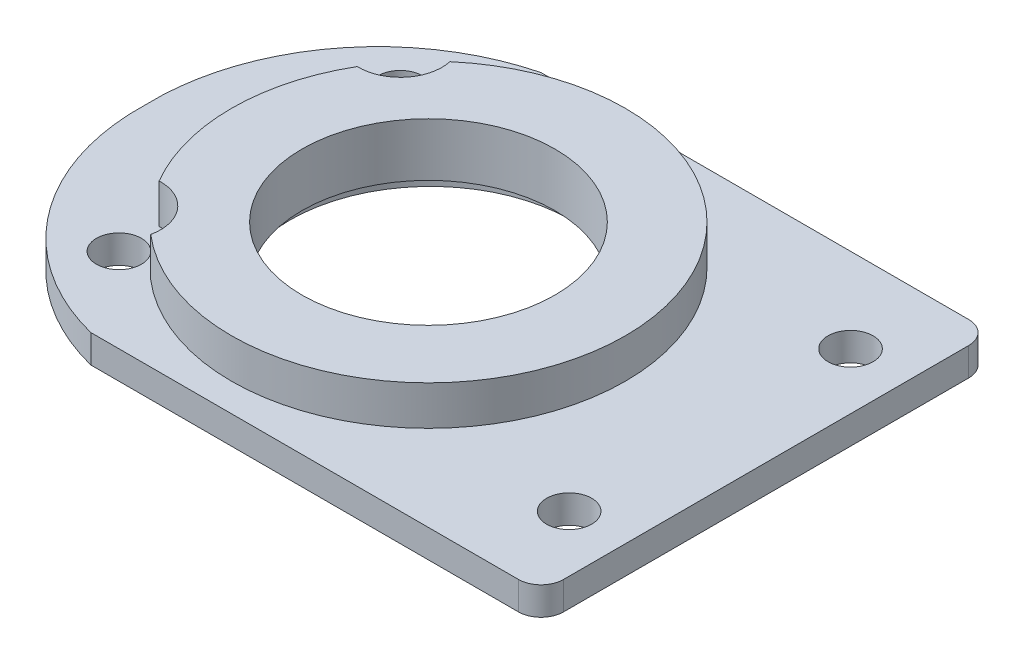
ISO-10303-21;
HEADER;
FILE_DESCRIPTION(('STEP AP214'),'2;1');
FILE_NAME('part.step','',(''),(''),'','','');
FILE_SCHEMA(('AUTOMOTIVE_DESIGN { 1 0 10303 214 1 1 1 1 }'));
ENDSEC;
DATA;
#1=APPLICATION_CONTEXT('core data for automotive mechanical design processes');
#2=APPLICATION_PROTOCOL_DEFINITION('international standard','automotive_design',2000,#1);
#3=PRODUCT_CONTEXT('',#1,'mechanical');
#4=PRODUCT('Part','Part','',(#3));
#5=PRODUCT_RELATED_PRODUCT_CATEGORY('part','',(#4));
#6=PRODUCT_DEFINITION_FORMATION('','',#4);
#7=PRODUCT_DEFINITION_CONTEXT('part definition',#1,'design');
#8=PRODUCT_DEFINITION('design','',#6,#7);
#9=PRODUCT_DEFINITION_SHAPE('','',#8);
#10=(LENGTH_UNIT() NAMED_UNIT(*) SI_UNIT(.MILLI.,.METRE.));
#11=(NAMED_UNIT(*) PLANE_ANGLE_UNIT() SI_UNIT($,.RADIAN.));
#12=(NAMED_UNIT(*) SI_UNIT($,.STERADIAN.) SOLID_ANGLE_UNIT());
#13=UNCERTAINTY_MEASURE_WITH_UNIT(LENGTH_MEASURE(1.E-05),#10,'distance_accuracy_value','');
#14=(GEOMETRIC_REPRESENTATION_CONTEXT(3) GLOBAL_UNCERTAINTY_ASSIGNED_CONTEXT((#13)) GLOBAL_UNIT_ASSIGNED_CONTEXT((#10,
#11,#12)) REPRESENTATION_CONTEXT('',''));
#15=CARTESIAN_POINT('',(0.,0.,0.));
#16=DIRECTION('',(0.,0.,1.));
#17=DIRECTION('',(1.,0.,0.));
#18=AXIS2_PLACEMENT_3D('',#15,#16,#17);
#19=CARTESIAN_POINT('',(38.1,7.62,-25.4));
#20=DIRECTION('',(0.,-1.,0.));
#21=DIRECTION('',(0.,0.,-1.));
#22=AXIS2_PLACEMENT_3D('',#19,#20,#21);
#23=CYLINDRICAL_SURFACE('',#22,22.225);
#24=DIRECTION('',(0.,-1.,0.));
#25=VECTOR('',#24,1.);
#26=CARTESIAN_POINT('',(23.6406384808785,5.3975,-42.2783141770542));
#27=LINE('',#26,#25);
#28=CARTESIAN_POINT('',(23.6406384808785,7.62,-42.2783141770542));
#29=VERTEX_POINT('',#28);
#30=CARTESIAN_POINT('',(23.6406384808785,3.175,-42.2783141770542));
#31=VERTEX_POINT('',#30);
#32=EDGE_CURVE('E121',#29,#31,#27,.T.);
#33=ORIENTED_EDGE('',*,*,#32,.F.);
#34=CARTESIAN_POINT('',(38.1,7.62,-25.4));
#35=DIRECTION('',(0.,1.,0.));
#36=DIRECTION('',(0.,0.,1.));
#37=AXIS2_PLACEMENT_3D('',#34,#35,#36);
#38=CIRCLE('',#37,22.225);
#39=CARTESIAN_POINT('',(23.6406384808785,7.62,-8.52168582294582));
#40=VERTEX_POINT('',#39);
#41=EDGE_CURVE('E216',#40,#29,#38,.T.);
#42=ORIENTED_EDGE('',*,*,#41,.F.);
#43=DIRECTION('',(0.,-1.,0.));
#44=VECTOR('',#43,1.);
#45=CARTESIAN_POINT('',(23.6406384808785,5.3975,-8.52168582294583));
#46=LINE('',#45,#44);
#47=CARTESIAN_POINT('',(23.6406384808785,3.175,-8.52168582294583));
#48=VERTEX_POINT('',#47);
#49=EDGE_CURVE('E62',#48,#40,#46,.F.);
#50=ORIENTED_EDGE('',*,*,#49,.F.);
#51=CARTESIAN_POINT('',(38.1,3.175,-25.4));
#52=DIRECTION('',(0.,-1.,0.));
#53=DIRECTION('',(0.,0.,-1.));
#54=AXIS2_PLACEMENT_3D('',#51,#52,#53);
#55=CIRCLE('',#54,22.225);
#56=EDGE_CURVE('E138',#48,#31,#55,.F.);
#57=ORIENTED_EDGE('',*,*,#56,.T.);
#58=EDGE_LOOP('',(#33,#42,#50,#57));
#59=FACE_BOUND('',#58,.T.);
#60=ADVANCED_FACE('F39',(#59),#23,.T.);
#61=DIRECTION('',(0.,-1.,0.));
#62=VECTOR('',#61,1.);
#63=CARTESIAN_POINT('',(18.8909536502691,5.3975,-36.5786923803229));
#64=LINE('',#63,#62);
#65=CARTESIAN_POINT('',(18.8909536502691,3.175,-36.5786923803229));
#66=VERTEX_POINT('',#65);
#67=CARTESIAN_POINT('',(18.8909536502691,7.62,-36.5786923803229));
#68=VERTEX_POINT('',#67);
#69=EDGE_CURVE('E55',#66,#68,#64,.F.);
#70=ORIENTED_EDGE('',*,*,#69,.F.);
#71=CARTESIAN_POINT('',(18.8909536502691,3.175,-14.2213076196771));
#72=VERTEX_POINT('',#71);
#73=EDGE_CURVE('E139',#66,#72,#55,.F.);
#74=ORIENTED_EDGE('',*,*,#73,.T.);
#75=DIRECTION('',(0.,-1.,0.));
#76=VECTOR('',#75,1.);
#77=CARTESIAN_POINT('',(18.8909536502691,5.3975,-14.2213076196771));
#78=LINE('',#77,#76);
#79=CARTESIAN_POINT('',(18.8909536502691,7.62,-14.2213076196771));
#80=VERTEX_POINT('',#79);
#81=EDGE_CURVE('E245',#80,#72,#78,.T.);
#82=ORIENTED_EDGE('',*,*,#81,.F.);
#83=EDGE_CURVE('E299',#68,#80,#38,.T.);
#84=ORIENTED_EDGE('',*,*,#83,.F.);
#85=EDGE_LOOP('',(#70,#74,#82,#84));
#86=FACE_BOUND('',#85,.T.);
#87=ADVANCED_FACE('F312',(#86),#23,.T.);
#88=CARTESIAN_POINT('',(0.,3.175,0.));
#89=DIRECTION('',(0.,-1.,0.));
#90=DIRECTION('',(0.,0.,-1.));
#91=AXIS2_PLACEMENT_3D('',#88,#89,#90);
#92=PLANE('',#91);
#93=ORIENTED_EDGE('',*,*,#73,.F.);
#94=CARTESIAN_POINT('',(19.05,3.175,-41.275));
#95=DIRECTION('',(0.,1.,0.));
#96=DIRECTION('',(0.,0.,1.));
#97=AXIS2_PLACEMENT_3D('',#94,#95,#96);
#98=CIRCLE('',#97,4.699);
#99=EDGE_CURVE('E124',#66,#31,#98,.T.);
#100=ORIENTED_EDGE('',*,*,#99,.T.);
#101=ORIENTED_EDGE('',*,*,#56,.F.);
#102=CARTESIAN_POINT('',(19.05,3.175,-9.525));
#103=DIRECTION('',(0.,1.,0.));
#104=DIRECTION('',(0.,0.,1.));
#105=AXIS2_PLACEMENT_3D('',#102,#103,#104);
#106=CIRCLE('',#105,4.699);
#107=EDGE_CURVE('E130',#48,#72,#106,.T.);
#108=ORIENTED_EDGE('',*,*,#107,.T.);
#109=EDGE_LOOP('',(#93,#100,#101,#108));
#110=FACE_BOUND('',#109,.T.);
#111=CARTESIAN_POINT('',(69.85,3.175,-41.275));
#112=DIRECTION('',(0.,-1.,0.));
#113=DIRECTION('',(0.,0.,-1.));
#114=AXIS2_PLACEMENT_3D('',#111,#112,#113);
#115=CIRCLE('',#114,2.54);
#116=CARTESIAN_POINT('',(69.85,3.175,-43.815));
#117=VERTEX_POINT('',#116);
#118=EDGE_CURVE('E274',#117,#117,#115,.T.);
#119=ORIENTED_EDGE('',*,*,#118,.T.);
#120=EDGE_LOOP('',(#119));
#121=FACE_BOUND('',#120,.T.);
#122=CARTESIAN_POINT('',(69.85,3.175,-9.525));
#123=DIRECTION('',(0.,-1.,0.));
#124=DIRECTION('',(0.,0.,-1.));
#125=AXIS2_PLACEMENT_3D('',#122,#123,#124);
#126=CIRCLE('',#125,2.54);
#127=CARTESIAN_POINT('',(69.85,3.175,-12.065));
#128=VERTEX_POINT('',#127);
#129=EDGE_CURVE('E278',#128,#128,#126,.T.);
#130=ORIENTED_EDGE('',*,*,#129,.T.);
#131=EDGE_LOOP('',(#130));
#132=FACE_BOUND('',#131,.T.);
#133=CARTESIAN_POINT('',(31.6209430961879,3.175,-26.1735943533416));
#134=DIRECTION('',(0.,1.,0.));
#135=DIRECTION('',(0.,0.,1.));
#136=AXIS2_PLACEMENT_3D('',#133,#134,#135);
#137=CIRCLE('',#136,25.4);
#138=CARTESIAN_POINT('',(25.3999999947823,3.175,-50.8));
#139=VERTEX_POINT('',#138);
#140=CARTESIAN_POINT('',(6.23398657381813,3.175,-25.3596910843292));
#141=VERTEX_POINT('',#140);
#142=EDGE_CURVE('E242',#139,#141,#137,.T.);
#143=ORIENTED_EDGE('',*,*,#142,.T.);
#144=CARTESIAN_POINT('',(31.6233817769977,3.175,-24.6257897171398));
#145=DIRECTION('',(0.,1.,0.));
#146=DIRECTION('',(0.,0.,1.));
#147=AXIS2_PLACEMENT_3D('',#144,#145,#146);
#148=CIRCLE('',#147,25.4);
#149=CARTESIAN_POINT('',(25.3999999947823,3.175,0.));
#150=VERTEX_POINT('',#149);
#151=EDGE_CURVE('E236',#150,#141,#148,.F.);
#152=ORIENTED_EDGE('',*,*,#151,.F.);
#153=DIRECTION('',(1.,0.,0.));
#154=VECTOR('',#153,1.);
#155=CARTESIAN_POINT('',(0.,3.175,0.));
#156=LINE('',#155,#154);
#157=CARTESIAN_POINT('',(73.66,3.175,0.));
#158=VERTEX_POINT('',#157);
#159=EDGE_CURVE('E187',#150,#158,#156,.T.);
#160=ORIENTED_EDGE('',*,*,#159,.T.);
#161=CARTESIAN_POINT('',(73.66,3.175,-2.54));
#162=DIRECTION('',(0.,-1.,0.));
#163=DIRECTION('',(0.,0.,-1.));
#164=AXIS2_PLACEMENT_3D('',#161,#162,#163);
#165=CIRCLE('',#164,2.54);
#166=CARTESIAN_POINT('',(76.2,3.175,-2.54));
#167=VERTEX_POINT('',#166);
#168=EDGE_CURVE('E167',#158,#167,#165,.F.);
#169=ORIENTED_EDGE('',*,*,#168,.T.);
#170=DIRECTION('',(0.,0.,-1.));
#171=VECTOR('',#170,1.);
#172=CARTESIAN_POINT('',(76.2,3.175,0.));
#173=LINE('',#172,#171);
#174=CARTESIAN_POINT('',(76.2,3.175,-48.26));
#175=VERTEX_POINT('',#174);
#176=EDGE_CURVE('E197',#167,#175,#173,.T.);
#177=ORIENTED_EDGE('',*,*,#176,.T.);
#178=CARTESIAN_POINT('',(73.66,3.175,-48.26));
#179=DIRECTION('',(0.,-1.,0.));
#180=DIRECTION('',(0.,0.,-1.));
#181=AXIS2_PLACEMENT_3D('',#178,#179,#180);
#182=CIRCLE('',#181,2.54);
#183=CARTESIAN_POINT('',(73.66,3.175,-50.8));
#184=VERTEX_POINT('',#183);
#185=EDGE_CURVE('E170',#175,#184,#182,.F.);
#186=ORIENTED_EDGE('',*,*,#185,.T.);
#187=DIRECTION('',(-1.,0.,0.));
#188=VECTOR('',#187,1.);
#189=CARTESIAN_POINT('',(0.,3.175,-50.8));
#190=LINE('',#189,#188);
#191=EDGE_CURVE('E150',#184,#139,#190,.T.);
#192=ORIENTED_EDGE('',*,*,#191,.T.);
#193=EDGE_LOOP('',(#143,#152,#160,#169,#177,#186,#192));
#194=FACE_BOUND('',#193,.T.);
#195=CARTESIAN_POINT('',(19.05,3.175,-9.525));
#196=DIRECTION('',(0.,-1.,0.));
#197=DIRECTION('',(0.,0.,-1.));
#198=AXIS2_PLACEMENT_3D('',#195,#196,#197);
#199=CIRCLE('',#198,2.54);
#200=CARTESIAN_POINT('',(19.05,3.175,-12.065));
#201=VERTEX_POINT('',#200);
#202=EDGE_CURVE('E282',#201,#201,#199,.T.);
#203=ORIENTED_EDGE('',*,*,#202,.T.);
#204=EDGE_LOOP('',(#203));
#205=FACE_BOUND('',#204,.T.);
#206=CARTESIAN_POINT('',(19.05,3.175,-41.275));
#207=DIRECTION('',(0.,-1.,0.));
#208=DIRECTION('',(0.,0.,-1.));
#209=AXIS2_PLACEMENT_3D('',#206,#207,#208);
#210=CIRCLE('',#209,2.54);
#211=CARTESIAN_POINT('',(19.05,3.175,-43.815));
#212=VERTEX_POINT('',#211);
#213=EDGE_CURVE('E286',#212,#212,#210,.T.);
#214=ORIENTED_EDGE('',*,*,#213,.T.);
#215=EDGE_LOOP('',(#214));
#216=FACE_BOUND('',#215,.T.);
#217=ADVANCED_FACE('F135',(#110,#121,#132,#194,#205,#216),#92,.F.);
#218=CARTESIAN_POINT('',(0.,0.,0.));
#219=DIRECTION('',(0.,-1.,0.));
#220=DIRECTION('',(0.,0.,-1.));
#221=AXIS2_PLACEMENT_3D('',#218,#219,#220);
#222=PLANE('',#221);
#223=CARTESIAN_POINT('',(19.05,0.,-41.275));
#224=DIRECTION('',(0.,1.,0.));
#225=DIRECTION('',(0.,0.,1.));
#226=AXIS2_PLACEMENT_3D('',#223,#224,#225);
#227=CIRCLE('',#226,2.54);
#228=CARTESIAN_POINT('',(19.05,0.,-38.735));
#229=VERTEX_POINT('',#228);
#230=EDGE_CURVE('E253',#229,#229,#227,.T.);
#231=ORIENTED_EDGE('',*,*,#230,.T.);
#232=EDGE_LOOP('',(#231));
#233=FACE_BOUND('',#232,.T.);
#234=CARTESIAN_POINT('',(19.05,0.,-9.525));
#235=DIRECTION('',(0.,1.,0.));
#236=DIRECTION('',(0.,0.,1.));
#237=AXIS2_PLACEMENT_3D('',#234,#235,#236);
#238=CIRCLE('',#237,2.54);
#239=CARTESIAN_POINT('',(19.05,0.,-6.985));
#240=VERTEX_POINT('',#239);
#241=EDGE_CURVE('E264',#240,#240,#238,.T.);
#242=ORIENTED_EDGE('',*,*,#241,.T.);
#243=EDGE_LOOP('',(#242));
#244=FACE_BOUND('',#243,.T.);
#245=CARTESIAN_POINT('',(69.85,0.,-9.525));
#246=DIRECTION('',(0.,1.,0.));
#247=DIRECTION('',(0.,0.,1.));
#248=AXIS2_PLACEMENT_3D('',#245,#246,#247);
#249=CIRCLE('',#248,2.54);
#250=CARTESIAN_POINT('',(69.85,0.,-6.985));
#251=VERTEX_POINT('',#250);
#252=EDGE_CURVE('E259',#251,#251,#249,.T.);
#253=ORIENTED_EDGE('',*,*,#252,.T.);
#254=EDGE_LOOP('',(#253));
#255=FACE_BOUND('',#254,.T.);
#256=CARTESIAN_POINT('',(69.85,0.,-41.275));
#257=DIRECTION('',(0.,1.,0.));
#258=DIRECTION('',(0.,0.,1.));
#259=AXIS2_PLACEMENT_3D('',#256,#257,#258);
#260=CIRCLE('',#259,2.54);
#261=CARTESIAN_POINT('',(69.85,0.,-38.735));
#262=VERTEX_POINT('',#261);
#263=EDGE_CURVE('E263',#262,#262,#260,.T.);
#264=ORIENTED_EDGE('',*,*,#263,.T.);
#265=EDGE_LOOP('',(#264));
#266=FACE_BOUND('',#265,.T.);
#267=CARTESIAN_POINT('',(38.3325078490202,0.,-25.4));
#268=DIRECTION('',(0.,-1.,0.));
#269=DIRECTION('',(0.,0.,-1.));
#270=AXIS2_PLACEMENT_3D('',#267,#268,#269);
#271=CIRCLE('',#270,15.8623);
#272=CARTESIAN_POINT('',(38.3325078490202,0.,-41.2623));
#273=VERTEX_POINT('',#272);
#274=EDGE_CURVE('E290',#273,#273,#271,.T.);
#275=ORIENTED_EDGE('',*,*,#274,.F.);
#276=EDGE_LOOP('',(#275));
#277=FACE_BOUND('',#276,.T.);
#278=CARTESIAN_POINT('',(31.6233817769977,0.,-24.6257897171398));
#279=DIRECTION('',(0.,1.,0.));
#280=DIRECTION('',(0.,0.,1.));
#281=AXIS2_PLACEMENT_3D('',#278,#279,#280);
#282=CIRCLE('',#281,25.4);
#283=CARTESIAN_POINT('',(25.3999999947823,0.,0.));
#284=VERTEX_POINT('',#283);
#285=CARTESIAN_POINT('',(6.23398657381813,0.,-25.3596910843292));
#286=VERTEX_POINT('',#285);
#287=EDGE_CURVE('E232',#284,#286,#282,.F.);
#288=ORIENTED_EDGE('',*,*,#287,.T.);
#289=CARTESIAN_POINT('',(31.6209430961879,0.,-26.1735943533416));
#290=DIRECTION('',(0.,1.,0.));
#291=DIRECTION('',(0.,0.,1.));
#292=AXIS2_PLACEMENT_3D('',#289,#290,#291);
#293=CIRCLE('',#292,25.4);
#294=CARTESIAN_POINT('',(25.399999041928,0.,-50.8));
#295=VERTEX_POINT('',#294);
#296=EDGE_CURVE('E231',#295,#286,#293,.T.);
#297=ORIENTED_EDGE('',*,*,#296,.F.);
#298=DIRECTION('',(-1.,0.,0.));
#299=VECTOR('',#298,1.);
#300=CARTESIAN_POINT('',(0.,0.,-50.8));
#301=LINE('',#300,#299);
#302=CARTESIAN_POINT('',(73.66,0.,-50.8));
#303=VERTEX_POINT('',#302);
#304=EDGE_CURVE('E153',#303,#295,#301,.T.);
#305=ORIENTED_EDGE('',*,*,#304,.F.);
#306=CARTESIAN_POINT('',(73.66,0.,-48.26));
#307=DIRECTION('',(0.,-1.,0.));
#308=DIRECTION('',(0.,0.,-1.));
#309=AXIS2_PLACEMENT_3D('',#306,#307,#308);
#310=CIRCLE('',#309,2.54);
#311=CARTESIAN_POINT('',(76.2,0.,-48.26));
#312=VERTEX_POINT('',#311);
#313=EDGE_CURVE('E148',#303,#312,#310,.T.);
#314=ORIENTED_EDGE('',*,*,#313,.T.);
#315=DIRECTION('',(0.,0.,-1.));
#316=VECTOR('',#315,1.);
#317=CARTESIAN_POINT('',(76.2,0.,0.));
#318=LINE('',#317,#316);
#319=CARTESIAN_POINT('',(76.2,0.,-2.54));
#320=VERTEX_POINT('',#319);
#321=EDGE_CURVE('E215',#320,#312,#318,.T.);
#322=ORIENTED_EDGE('',*,*,#321,.F.);
#323=CARTESIAN_POINT('',(73.66,0.,-2.54));
#324=DIRECTION('',(0.,-1.,0.));
#325=DIRECTION('',(0.,0.,-1.));
#326=AXIS2_PLACEMENT_3D('',#323,#324,#325);
#327=CIRCLE('',#326,2.54);
#328=CARTESIAN_POINT('',(73.66,0.,0.));
#329=VERTEX_POINT('',#328);
#330=EDGE_CURVE('E143',#320,#329,#327,.T.);
#331=ORIENTED_EDGE('',*,*,#330,.T.);
#332=DIRECTION('',(1.,0.,0.));
#333=VECTOR('',#332,1.);
#334=CARTESIAN_POINT('',(0.,0.,0.));
#335=LINE('',#334,#333);
#336=EDGE_CURVE('E189',#284,#329,#335,.T.);
#337=ORIENTED_EDGE('',*,*,#336,.F.);
#338=EDGE_LOOP('',(#288,#297,#305,#314,#322,#331,#337));
#339=FACE_BOUND('',#338,.T.);
#340=ADVANCED_FACE('F230',(#233,#244,#255,#266,#277,#339),#222,.T.);
#341=CARTESIAN_POINT('',(0.,3.175,-50.8));
#342=DIRECTION('',(0.,0.,1.));
#343=DIRECTION('',(1.,0.,0.));
#344=AXIS2_PLACEMENT_3D('',#341,#342,#343);
#345=PLANE('',#344);
#346=DIRECTION('',(0.,1.,0.));
#347=VECTOR('',#346,1.);
#348=CARTESIAN_POINT('',(25.399999041928,0.,-50.8));
#349=LINE('',#348,#347);
#350=EDGE_CURVE('E225',#295,#139,#349,.T.);
#351=ORIENTED_EDGE('',*,*,#350,.T.);
#352=ORIENTED_EDGE('',*,*,#191,.F.);
#353=DIRECTION('',(0.,-1.,0.));
#354=VECTOR('',#353,1.);
#355=CARTESIAN_POINT('',(73.66,3.175,-50.8));
#356=LINE('',#355,#354);
#357=EDGE_CURVE('E163',#184,#303,#356,.T.);
#358=ORIENTED_EDGE('',*,*,#357,.T.);
#359=ORIENTED_EDGE('',*,*,#304,.T.);
#360=EDGE_LOOP('',(#351,#352,#358,#359));
#361=FACE_BOUND('',#360,.T.);
#362=ADVANCED_FACE('F223',(#361),#345,.F.);
#363=CARTESIAN_POINT('',(38.1,3.175,-25.4));
#364=DIRECTION('',(0.,-1.,0.));
#365=DIRECTION('',(0.,0.,-1.));
#366=AXIS2_PLACEMENT_3D('',#363,#364,#365);
#367=CYLINDRICAL_SURFACE('',#366,14.2748);
#368=CARTESIAN_POINT('',(38.1,7.62,-25.4));
#369=DIRECTION('',(0.,-1.,0.));
#370=DIRECTION('',(0.,0.,-1.));
#371=AXIS2_PLACEMENT_3D('',#368,#369,#370);
#372=CIRCLE('',#371,14.2748);
#373=CARTESIAN_POINT('',(38.1,7.62,-39.6748));
#374=VERTEX_POINT('',#373);
#375=EDGE_CURVE('E158',#374,#374,#372,.T.);
#376=ORIENTED_EDGE('',*,*,#375,.F.);
#377=EDGE_LOOP('',(#376));
#378=FACE_BOUND('',#377,.T.);
#379=CARTESIAN_POINT('',(38.1,1.6002,-25.4));
#380=DIRECTION('',(0.,-1.,0.));
#381=DIRECTION('',(0.,0.,-1.));
#382=AXIS2_PLACEMENT_3D('',#379,#380,#381);
#383=CIRCLE('',#382,14.2748);
#384=CARTESIAN_POINT('',(38.1,1.6002,-39.6748));
#385=VERTEX_POINT('',#384);
#386=EDGE_CURVE('E155',#385,#385,#383,.T.);
#387=ORIENTED_EDGE('',*,*,#386,.T.);
#388=EDGE_LOOP('',(#387));
#389=FACE_BOUND('',#388,.T.);
#390=ADVANCED_FACE('F329',(#378,#389),#367,.F.);
#391=CARTESIAN_POINT('',(0.,3.175,0.));
#392=DIRECTION('',(0.,0.,-1.));
#393=DIRECTION('',(-1.,0.,0.));
#394=AXIS2_PLACEMENT_3D('',#391,#392,#393);
#395=PLANE('',#394);
#396=ORIENTED_EDGE('',*,*,#159,.F.);
#397=DIRECTION('',(0.,1.,0.));
#398=VECTOR('',#397,1.);
#399=CARTESIAN_POINT('',(25.3999999947823,0.,0.));
#400=LINE('',#399,#398);
#401=EDGE_CURVE('E254',#284,#150,#400,.T.);
#402=ORIENTED_EDGE('',*,*,#401,.F.);
#403=ORIENTED_EDGE('',*,*,#336,.T.);
#404=DIRECTION('',(0.,-1.,0.));
#405=VECTOR('',#404,1.);
#406=CARTESIAN_POINT('',(73.66,3.175,0.));
#407=LINE('',#406,#405);
#408=EDGE_CURVE('E48',#329,#158,#407,.F.);
#409=ORIENTED_EDGE('',*,*,#408,.T.);
#410=EDGE_LOOP('',(#396,#402,#403,#409));
#411=FACE_BOUND('',#410,.T.);
#412=ADVANCED_FACE('F185',(#411),#395,.F.);
#413=CARTESIAN_POINT('',(76.2,3.175,0.));
#414=DIRECTION('',(-1.,0.,0.));
#415=DIRECTION('',(0.,0.,1.));
#416=AXIS2_PLACEMENT_3D('',#413,#414,#415);
#417=PLANE('',#416);
#418=ORIENTED_EDGE('',*,*,#321,.T.);
#419=DIRECTION('',(0.,-1.,0.));
#420=VECTOR('',#419,1.);
#421=CARTESIAN_POINT('',(76.2,3.175,-48.26));
#422=LINE('',#421,#420);
#423=EDGE_CURVE('E177',#312,#175,#422,.F.);
#424=ORIENTED_EDGE('',*,*,#423,.T.);
#425=ORIENTED_EDGE('',*,*,#176,.F.);
#426=DIRECTION('',(0.,-1.,0.));
#427=VECTOR('',#426,1.);
#428=CARTESIAN_POINT('',(76.2,3.175,-2.54));
#429=LINE('',#428,#427);
#430=EDGE_CURVE('E173',#167,#320,#429,.T.);
#431=ORIENTED_EDGE('',*,*,#430,.T.);
#432=EDGE_LOOP('',(#418,#424,#425,#431));
#433=FACE_BOUND('',#432,.T.);
#434=ADVANCED_FACE('F202',(#433),#417,.F.);
#435=CARTESIAN_POINT('',(38.1,7.62,-25.4));
#436=DIRECTION('',(0.,1.,0.));
#437=DIRECTION('',(0.,0.,1.));
#438=AXIS2_PLACEMENT_3D('',#435,#436,#437);
#439=PLANE('',#438);
#440=ORIENTED_EDGE('',*,*,#375,.T.);
#441=EDGE_LOOP('',(#440));
#442=FACE_BOUND('',#441,.T.);
#443=ORIENTED_EDGE('',*,*,#41,.T.);
#444=CARTESIAN_POINT('',(19.05,7.62,-41.275));
#445=DIRECTION('',(0.,1.,0.));
#446=DIRECTION('',(0.,0.,1.));
#447=AXIS2_PLACEMENT_3D('',#444,#445,#446);
#448=CIRCLE('',#447,4.699);
#449=EDGE_CURVE('E11',#29,#68,#448,.F.);
#450=ORIENTED_EDGE('',*,*,#449,.T.);
#451=ORIENTED_EDGE('',*,*,#83,.T.);
#452=CARTESIAN_POINT('',(19.05,7.62,-9.525));
#453=DIRECTION('',(0.,1.,0.));
#454=DIRECTION('',(0.,0.,1.));
#455=AXIS2_PLACEMENT_3D('',#452,#453,#454);
#456=CIRCLE('',#455,4.699);
#457=EDGE_CURVE('E305',#40,#80,#456,.T.);
#458=ORIENTED_EDGE('',*,*,#457,.F.);
#459=EDGE_LOOP('',(#443,#450,#451,#458));
#460=FACE_BOUND('',#459,.T.);
#461=ADVANCED_FACE('F304',(#442,#460),#439,.T.);
#462=CARTESIAN_POINT('',(38.3325078490202,1.6002,-25.4));
#463=DIRECTION('',(0.,-1.,0.));
#464=DIRECTION('',(0.,0.,-1.));
#465=AXIS2_PLACEMENT_3D('',#462,#463,#464);
#466=CYLINDRICAL_SURFACE('',#465,15.8623);
#467=CARTESIAN_POINT('',(38.3325078490202,1.6002,-25.4));
#468=DIRECTION('',(0.,-1.,0.));
#469=DIRECTION('',(0.,0.,-1.));
#470=AXIS2_PLACEMENT_3D('',#467,#468,#469);
#471=CIRCLE('',#470,15.8623);
#472=CARTESIAN_POINT('',(38.3325078490202,1.6002,-41.2623));
#473=VERTEX_POINT('',#472);
#474=EDGE_CURVE('E159',#473,#473,#471,.T.);
#475=ORIENTED_EDGE('',*,*,#474,.F.);
#476=EDGE_LOOP('',(#475));
#477=FACE_BOUND('',#476,.T.);
#478=ORIENTED_EDGE('',*,*,#274,.T.);
#479=EDGE_LOOP('',(#478));
#480=FACE_BOUND('',#479,.T.);
#481=ADVANCED_FACE('F350',(#477,#480),#466,.F.);
#482=CARTESIAN_POINT('',(38.3325078490202,1.6002,-25.4));
#483=DIRECTION('',(0.,-1.,0.));
#484=DIRECTION('',(0.,0.,-1.));
#485=AXIS2_PLACEMENT_3D('',#482,#483,#484);
#486=PLANE('',#485);
#487=ORIENTED_EDGE('',*,*,#386,.F.);
#488=EDGE_LOOP('',(#487));
#489=FACE_BOUND('',#488,.T.);
#490=ORIENTED_EDGE('',*,*,#474,.T.);
#491=EDGE_LOOP('',(#490));
#492=FACE_BOUND('',#491,.T.);
#493=ADVANCED_FACE('F343',(#489,#492),#486,.T.);
#494=CARTESIAN_POINT('',(73.66,3.175,-48.26));
#495=DIRECTION('',(0.,-1.,0.));
#496=DIRECTION('',(0.,0.,-1.));
#497=AXIS2_PLACEMENT_3D('',#494,#495,#496);
#498=CYLINDRICAL_SURFACE('',#497,2.54);
#499=ORIENTED_EDGE('',*,*,#185,.F.);
#500=ORIENTED_EDGE('',*,*,#423,.F.);
#501=ORIENTED_EDGE('',*,*,#313,.F.);
#502=ORIENTED_EDGE('',*,*,#357,.F.);
#503=EDGE_LOOP('',(#499,#500,#501,#502));
#504=FACE_BOUND('',#503,.T.);
#505=ADVANCED_FACE('F341',(#504),#498,.T.);
#506=CARTESIAN_POINT('',(73.66,3.175,-2.54));
#507=DIRECTION('',(0.,-1.,0.));
#508=DIRECTION('',(0.,0.,-1.));
#509=AXIS2_PLACEMENT_3D('',#506,#507,#508);
#510=CYLINDRICAL_SURFACE('',#509,2.54);
#511=ORIENTED_EDGE('',*,*,#168,.F.);
#512=ORIENTED_EDGE('',*,*,#408,.F.);
#513=ORIENTED_EDGE('',*,*,#330,.F.);
#514=ORIENTED_EDGE('',*,*,#430,.F.);
#515=EDGE_LOOP('',(#511,#512,#513,#514));
#516=FACE_BOUND('',#515,.T.);
#517=ADVANCED_FACE('F41',(#516),#510,.T.);
#518=CARTESIAN_POINT('',(69.85,0.,-41.275));
#519=DIRECTION('',(0.,1.,0.));
#520=DIRECTION('',(0.,0.,1.));
#521=AXIS2_PLACEMENT_3D('',#518,#519,#520);
#522=CYLINDRICAL_SURFACE('',#521,2.54);
#523=ORIENTED_EDGE('',*,*,#263,.F.);
#524=EDGE_LOOP('',(#523));
#525=FACE_BOUND('',#524,.T.);
#526=ORIENTED_EDGE('',*,*,#118,.F.);
#527=EDGE_LOOP('',(#526));
#528=FACE_BOUND('',#527,.T.);
#529=ADVANCED_FACE('F349',(#525,#528),#522,.F.);
#530=CARTESIAN_POINT('',(69.85,0.,-9.525));
#531=DIRECTION('',(0.,1.,0.));
#532=DIRECTION('',(0.,0.,1.));
#533=AXIS2_PLACEMENT_3D('',#530,#531,#532);
#534=CYLINDRICAL_SURFACE('',#533,2.54);
#535=ORIENTED_EDGE('',*,*,#252,.F.);
#536=EDGE_LOOP('',(#535));
#537=FACE_BOUND('',#536,.T.);
#538=ORIENTED_EDGE('',*,*,#129,.F.);
#539=EDGE_LOOP('',(#538));
#540=FACE_BOUND('',#539,.T.);
#541=ADVANCED_FACE('F367',(#537,#540),#534,.F.);
#542=CARTESIAN_POINT('',(19.05,0.,-9.525));
#543=DIRECTION('',(0.,1.,0.));
#544=DIRECTION('',(0.,0.,1.));
#545=AXIS2_PLACEMENT_3D('',#542,#543,#544);
#546=CYLINDRICAL_SURFACE('',#545,2.54);
#547=ORIENTED_EDGE('',*,*,#241,.F.);
#548=EDGE_LOOP('',(#547));
#549=FACE_BOUND('',#548,.T.);
#550=ORIENTED_EDGE('',*,*,#202,.F.);
#551=EDGE_LOOP('',(#550));
#552=FACE_BOUND('',#551,.T.);
#553=ADVANCED_FACE('F370',(#549,#552),#546,.F.);
#554=CARTESIAN_POINT('',(19.05,0.,-41.275));
#555=DIRECTION('',(0.,1.,0.));
#556=DIRECTION('',(0.,0.,1.));
#557=AXIS2_PLACEMENT_3D('',#554,#555,#556);
#558=CYLINDRICAL_SURFACE('',#557,2.54);
#559=ORIENTED_EDGE('',*,*,#230,.F.);
#560=EDGE_LOOP('',(#559));
#561=FACE_BOUND('',#560,.T.);
#562=ORIENTED_EDGE('',*,*,#213,.F.);
#563=EDGE_LOOP('',(#562));
#564=FACE_BOUND('',#563,.T.);
#565=ADVANCED_FACE('F363',(#561,#564),#558,.F.);
#566=CARTESIAN_POINT('',(31.6209430961879,0.,-26.1735943533416));
#567=DIRECTION('',(0.,1.,0.));
#568=DIRECTION('',(0.,0.,1.));
#569=AXIS2_PLACEMENT_3D('',#566,#567,#568);
#570=CYLINDRICAL_SURFACE('',#569,25.4);
#571=ORIENTED_EDGE('',*,*,#142,.F.);
#572=ORIENTED_EDGE('',*,*,#350,.F.);
#573=ORIENTED_EDGE('',*,*,#296,.T.);
#574=DIRECTION('',(0.,1.,0.));
#575=VECTOR('',#574,1.);
#576=CARTESIAN_POINT('',(6.23398657381813,0.,-25.3596910843292));
#577=LINE('',#576,#575);
#578=EDGE_CURVE('E250',#286,#141,#577,.T.);
#579=ORIENTED_EDGE('',*,*,#578,.T.);
#580=EDGE_LOOP('',(#571,#572,#573,#579));
#581=FACE_BOUND('',#580,.T.);
#582=ADVANCED_FACE('F353',(#581),#570,.T.);
#583=CARTESIAN_POINT('',(31.6233817769977,0.,-24.6257897171398));
#584=DIRECTION('',(0.,1.,0.));
#585=DIRECTION('',(0.,0.,1.));
#586=AXIS2_PLACEMENT_3D('',#583,#584,#585);
#587=CYLINDRICAL_SURFACE('',#586,25.4);
#588=ORIENTED_EDGE('',*,*,#151,.T.);
#589=ORIENTED_EDGE('',*,*,#578,.F.);
#590=ORIENTED_EDGE('',*,*,#287,.F.);
#591=ORIENTED_EDGE('',*,*,#401,.T.);
#592=EDGE_LOOP('',(#588,#589,#590,#591));
#593=FACE_BOUND('',#592,.T.);
#594=ADVANCED_FACE('F355',(#593),#587,.T.);
#595=CARTESIAN_POINT('',(19.05,7.62,-9.525));
#596=DIRECTION('',(0.,-1.,0.));
#597=DIRECTION('',(0.,0.,-1.));
#598=AXIS2_PLACEMENT_3D('',#595,#596,#597);
#599=CYLINDRICAL_SURFACE('',#598,4.699);
#600=ORIENTED_EDGE('',*,*,#81,.T.);
#601=ORIENTED_EDGE('',*,*,#107,.F.);
#602=ORIENTED_EDGE('',*,*,#49,.T.);
#603=ORIENTED_EDGE('',*,*,#457,.T.);
#604=EDGE_LOOP('',(#600,#601,#602,#603));
#605=FACE_BOUND('',#604,.T.);
#606=ADVANCED_FACE('F309',(#605),#599,.F.);
#607=CARTESIAN_POINT('',(19.05,7.62,-41.275));
#608=DIRECTION('',(0.,-1.,0.));
#609=DIRECTION('',(0.,0.,-1.));
#610=AXIS2_PLACEMENT_3D('',#607,#608,#609);
#611=CYLINDRICAL_SURFACE('',#610,4.699);
#612=ORIENTED_EDGE('',*,*,#32,.T.);
#613=ORIENTED_EDGE('',*,*,#99,.F.);
#614=ORIENTED_EDGE('',*,*,#69,.T.);
#615=ORIENTED_EDGE('',*,*,#449,.F.);
#616=EDGE_LOOP('',(#612,#613,#614,#615));
#617=FACE_BOUND('',#616,.T.);
#618=ADVANCED_FACE('F123',(#617),#611,.F.);
#619=CLOSED_SHELL('',(#60,#87,#217,#340,#362,#390,#412,#434,#461,#481,#493,#505,#517,#529,#541,
#553,#565,#582,#594,#606,#618));
#620=MANIFOLD_SOLID_BREP('B2',#619);
#621=ADVANCED_BREP_SHAPE_REPRESENTATION('',(#18,#620),#14);
#622=SHAPE_DEFINITION_REPRESENTATION(#9,#621);
ENDSEC;
END-ISO-10303-21;
